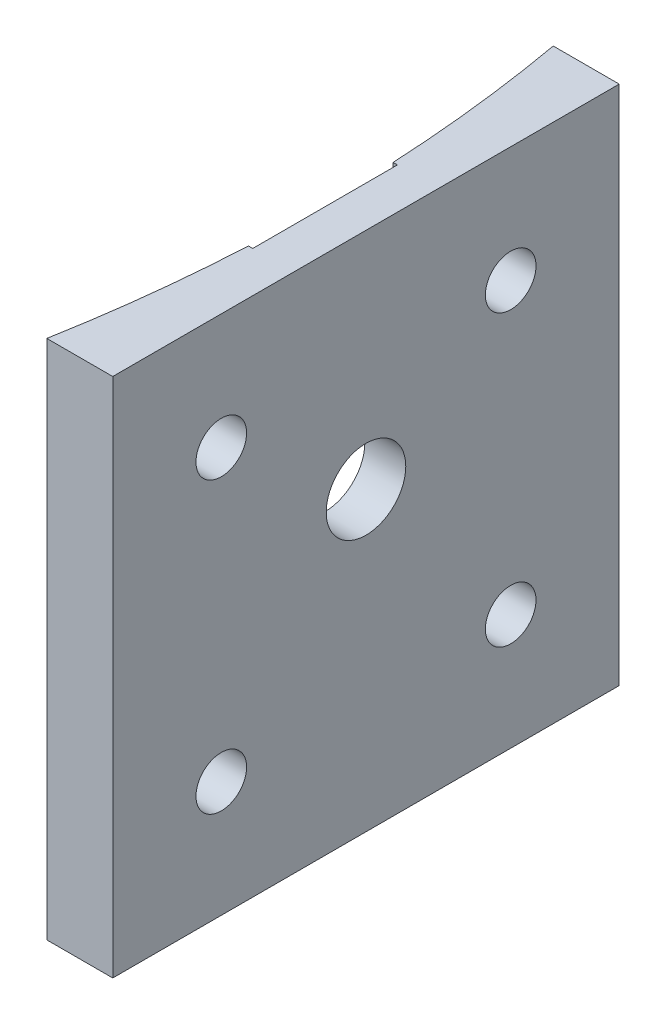
ISO-10303-21;
HEADER;
FILE_DESCRIPTION(('STEP AP214'),'2;1');
FILE_NAME('part.step','',(''),(''),'','','');
FILE_SCHEMA(('AUTOMOTIVE_DESIGN { 1 0 10303 214 1 1 1 1 }'));
ENDSEC;
DATA;
#1=APPLICATION_CONTEXT('core data for automotive mechanical design processes');
#2=APPLICATION_PROTOCOL_DEFINITION('international standard','automotive_design',2000,#1);
#3=PRODUCT_CONTEXT('',#1,'mechanical');
#4=PRODUCT('Part','Part','',(#3));
#5=PRODUCT_RELATED_PRODUCT_CATEGORY('part','',(#4));
#6=PRODUCT_DEFINITION_FORMATION('','',#4);
#7=PRODUCT_DEFINITION_CONTEXT('part definition',#1,'design');
#8=PRODUCT_DEFINITION('design','',#6,#7);
#9=PRODUCT_DEFINITION_SHAPE('','',#8);
#10=(LENGTH_UNIT() NAMED_UNIT(*) SI_UNIT(.MILLI.,.METRE.));
#11=(NAMED_UNIT(*) PLANE_ANGLE_UNIT() SI_UNIT($,.RADIAN.));
#12=(NAMED_UNIT(*) SI_UNIT($,.STERADIAN.) SOLID_ANGLE_UNIT());
#13=UNCERTAINTY_MEASURE_WITH_UNIT(LENGTH_MEASURE(1.E-05),#10,'distance_accuracy_value','');
#14=(GEOMETRIC_REPRESENTATION_CONTEXT(3) GLOBAL_UNCERTAINTY_ASSIGNED_CONTEXT((#13)) GLOBAL_UNIT_ASSIGNED_CONTEXT((#10,
#11,#12)) REPRESENTATION_CONTEXT('',''));
#15=CARTESIAN_POINT('',(0.,0.,0.));
#16=DIRECTION('',(0.,0.,1.));
#17=DIRECTION('',(1.,0.,0.));
#18=AXIS2_PLACEMENT_3D('',#15,#16,#17);
#19=CARTESIAN_POINT('',(-102.,36.,0.));
#20=DIRECTION('',(0.,-1.,0.));
#21=DIRECTION('',(0.,0.,-1.));
#22=AXIS2_PLACEMENT_3D('',#19,#20,#21);
#23=CYLINDRICAL_SURFACE('',#22,99.);
#24=CARTESIAN_POINT('',(-3.6997583929724,28.,-11.75));
#25=CARTESIAN_POINT('',(-3.69975773239781,28.0978039488489,-11.7499955788712));
#26=CARTESIAN_POINT('',(-3.69877385201636,28.1956789308559,-11.7417724058967));
#27=CARTESIAN_POINT('',(-3.69487606208546,28.3887228032019,-11.7090933771447));
#28=CARTESIAN_POINT('',(-3.69195983137928,28.4838882953142,-11.684617998996));
#29=CARTESIAN_POINT('',(-3.68432061460992,28.6686782342036,-11.6201649597345));
#30=CARTESIAN_POINT('',(-3.67959878881144,28.7583061964915,-11.5801972536747));
#31=CARTESIAN_POINT('',(-3.66854264853962,28.9295398076865,-11.4859364462371));
#32=CARTESIAN_POINT('',(-3.66220870634348,29.0111473026935,-11.4316466520754));
#33=CARTESIAN_POINT('',(-3.64815367371014,29.1643747689419,-11.3100870747429));
#34=CARTESIAN_POINT('',(-3.64042780533748,29.2359587801684,-11.2427725218996));
#35=CARTESIAN_POINT('',(-3.62389829897048,29.3668287607726,-11.0972054730592));
#36=CARTESIAN_POINT('',(-3.6150945846844,29.4261138588112,-11.0189522027457));
#37=CARTESIAN_POINT('',(-3.59666955002114,29.5311004443614,-10.8531813276407));
#38=CARTESIAN_POINT('',(-3.58704333144818,29.5767120367381,-10.7656073301989));
#39=CARTESIAN_POINT('',(-3.56735599582918,29.6525792466574,-10.5840881195322));
#40=CARTESIAN_POINT('',(-3.55729486673741,29.6828344385771,-10.4901427297975));
#41=CARTESIAN_POINT('',(-3.5370160332051,29.7272576485935,-10.2980654705491));
#42=CARTESIAN_POINT('',(-3.5267978144062,29.7413492022434,-10.1999159622375));
#43=CARTESIAN_POINT('',(-3.50656200492344,29.752785485012,-10.0026248665384));
#44=CARTESIAN_POINT('',(-3.4965444157462,29.750130088418,-9.90348327170942));
#45=CARTESIAN_POINT('',(-3.47698107162729,29.7281198786233,-9.70693082736418));
#46=CARTESIAN_POINT('',(-3.46743575001202,29.7087500189687,-9.60952161801126));
#47=CARTESIAN_POINT('',(-3.44907035357473,29.6538132914452,-9.41931002198861));
#48=CARTESIAN_POINT('',(-3.44025027199138,29.6182465745983,-9.3265075923735));
#49=CARTESIAN_POINT('',(-3.42355952650221,29.5320102666403,-9.14840818114499));
#50=CARTESIAN_POINT('',(-3.41568649926002,29.4813794136197,-9.06309266662271));
#51=CARTESIAN_POINT('',(-3.40102444365241,29.3663964629136,-8.90216593529734));
#52=CARTESIAN_POINT('',(-3.39423539211206,29.3020446586448,-8.82655451103176));
#53=CARTESIAN_POINT('',(-3.38188906689232,29.161730965499,-8.68752315728345));
#54=CARTESIAN_POINT('',(-3.37632681572983,29.0858181863005,-8.62405410719339));
#55=CARTESIAN_POINT('',(-3.36648570136439,28.9243389836349,-8.51076384759874));
#56=CARTESIAN_POINT('',(-3.36220681109227,28.8387727638345,-8.4609423502363));
#57=CARTESIAN_POINT('',(-3.35500528274996,28.6607703391094,-8.37656328242491));
#58=CARTESIAN_POINT('',(-3.35207750093895,28.5683617699822,-8.3419478463329));
#59=CARTESIAN_POINT('',(-3.34758984767495,28.3790158676386,-8.28870865503887));
#60=CARTESIAN_POINT('',(-3.34602995531453,28.2820786036648,-8.27008465541683));
#61=CARTESIAN_POINT('',(-3.34429778746244,28.0866809276634,-8.24939577639322));
#62=CARTESIAN_POINT('',(-3.34412213222219,27.9882248139451,-8.24729056482981));
#63=CARTESIAN_POINT('',(-3.34515143774367,27.7923576497601,-8.25959392823825));
#64=CARTESIAN_POINT('',(-3.34635638909305,27.6949465921732,-8.27400239062735));
#65=CARTESIAN_POINT('',(-3.35013228511452,27.5039992985341,-8.31890026442874));
#66=CARTESIAN_POINT('',(-3.35270233865219,27.4104605775231,-8.34937918500149));
#67=CARTESIAN_POINT('',(-3.35917734250368,27.2298373251328,-8.42553008658813));
#68=CARTESIAN_POINT('',(-3.3630822958485,27.1427528084088,-8.47120210209913));
#69=CARTESIAN_POINT('',(-3.37218105847478,26.9773919868962,-8.5764861895789));
#70=CARTESIAN_POINT('',(-3.37737640464405,26.8991263483559,-8.63611487935421));
#71=CARTESIAN_POINT('',(-3.38897581829714,26.753718261993,-8.76756819529909));
#72=CARTESIAN_POINT('',(-3.39537990106508,26.686575954842,-8.83939297568356));
#73=CARTESIAN_POINT('',(-3.40930800893146,26.5651044659355,-8.99341077777969));
#74=CARTESIAN_POINT('',(-3.4168352393604,26.5108131453912,-9.0756333677135));
#75=CARTESIAN_POINT('',(-3.43284953762148,26.4167966558975,-9.24793635730128));
#76=CARTESIAN_POINT('',(-3.44133662454492,26.3770717767377,-9.33801691324006));
#77=CARTESIAN_POINT('',(-3.45912140319884,26.3131419353179,-9.52386407482154));
#78=CARTESIAN_POINT('',(-3.46842224956576,26.2890007130387,-9.61965230421147));
#79=CARTESIAN_POINT('',(-3.48757694206297,26.2571461132054,-9.81386887520426));
#80=CARTESIAN_POINT('',(-3.4974308025957,26.2494331637053,-9.91229728553184));
#81=CARTESIAN_POINT('',(-3.51746486132502,26.2506341170585,-10.1094076830143));
#82=CARTESIAN_POINT('',(-3.5276461812943,26.2596129105942,-10.2080891642196));
#83=CARTESIAN_POINT('',(-3.5479970587279,26.2940641938141,-10.4025322400344));
#84=CARTESIAN_POINT('',(-3.55816661598021,26.3195369762626,-10.4982937827842));
#85=CARTESIAN_POINT('',(-3.57818655734018,26.3863250863225,-10.684353789045));
#86=CARTESIAN_POINT('',(-3.58803634502226,26.4276683589754,-10.774642288957));
#87=CARTESIAN_POINT('',(-3.60705888063857,26.5250425879005,-10.9469933945607));
#88=CARTESIAN_POINT('',(-3.61623165797823,26.5810729057703,-11.0290563575781));
#89=CARTESIAN_POINT('',(-3.63354692887308,26.7061234750692,-11.1824355746292));
#90=CARTESIAN_POINT('',(-3.6416915727635,26.7751158378105,-11.25377432006));
#91=CARTESIAN_POINT('',(-3.65666231092752,26.9242551967324,-11.3838583993976));
#92=CARTESIAN_POINT('',(-3.66348811315717,27.004404656793,-11.4426009443207));
#93=CARTESIAN_POINT('',(-3.67551356315785,27.1731275090035,-11.5454772334505));
#94=CARTESIAN_POINT('',(-3.68072126396407,27.2616562271525,-11.5896833892965));
#95=CARTESIAN_POINT('',(-3.68933722063227,27.44489331161,-11.6625444545664));
#96=CARTESIAN_POINT('',(-3.69274772603317,27.5395937850399,-11.6912188063192));
#97=CARTESIAN_POINT('',(-3.69670557131032,27.6957663788834,-11.7244383985689));
#98=CARTESIAN_POINT('',(-3.69784836912808,27.7562002008317,-11.7340115392699));
#99=CARTESIAN_POINT('',(-3.69937498488005,27.8777467639867,-11.7467937088638));
#100=CARTESIAN_POINT('',(-3.69975880591953,27.9388595024146,-11.7500027637945));
#101=CARTESIAN_POINT('',(-3.6997583929724,28.,-11.75));
#102=B_SPLINE_CURVE_WITH_KNOTS('',3,(#24,#25,#26,#27,#28,#29,#30,#31,#32,#33,#34,#35,#36,#37,
#38,#39,#40,#41,#42,#43,#44,#45,#46,#47,#48,#49,#50,#51,#52,#53,#54,#55,#56,#57,#58,#59,#60,#61,
#62,#63,#64,#65,#66,#67,#68,#69,#70,#71,#72,#73,#74,#75,#76,#77,#78,#79,#80,#81,#82,#83,#84,#85,
#86,#87,#88,#89,#90,#91,#92,#93,#94,#95,#96,#97,#98,#99,#100,#101),.UNSPECIFIED.,.T.,.F.,(4,2,2,
2,2,2,2,2,2,2,2,2,2,2,2,2,2,2,2,2,2,2,2,2,2,2,2,2,2,2,2,2,2,2,2,2,2,2,4),(0.,0.293187804268997,
0.586728428378113,0.880080741144629,1.17336537303324,1.46767661195626,1.76200869478049,
2.05823541286853,2.35447034082239,2.65210094553959,2.94973378445385,3.24763483397235,
3.54553310587342,3.84267184460008,4.13980422977777,4.43570793150258,4.73160539146626,
5.02636686741931,5.32112383803069,5.61516090737778,5.90919597212512,6.20303932718503,
6.49688334944354,6.79107903922151,7.08527844926838,7.38033412327548,7.67539566689779,
7.97165654435701,8.26792514107702,8.56534791843978,8.86277597513033,9.16073016869785,
9.45867141322246,9.75597881034411,10.0533519678739,10.3492205206003,10.6447178514117,
10.8280000377739,11.0112814742595),.UNSPECIFIED.);
#103=CARTESIAN_POINT('',(-3.6997583929724,28.,-11.75));
#104=VERTEX_POINT('',#103);
#105=EDGE_CURVE('E173',#104,#104,#102,.T.);
#106=ORIENTED_EDGE('',*,*,#105,.T.);
#107=EDGE_LOOP('',(#106));
#108=FACE_BOUND('',#107,.T.);
#109=CARTESIAN_POINT('',(-3.69975839297242,8.,-11.75));
#110=CARTESIAN_POINT('',(-3.69975773239783,8.09780394884888,-11.7499955788712));
#111=CARTESIAN_POINT('',(-3.69877385201636,8.19567893085588,-11.7417724058967));
#112=CARTESIAN_POINT('',(-3.69487606208545,8.38872280320192,-11.7090933771447));
#113=CARTESIAN_POINT('',(-3.69195983137927,8.48388829531422,-11.684617998996));
#114=CARTESIAN_POINT('',(-3.68432061460993,8.66867823420361,-11.6201649597346));
#115=CARTESIAN_POINT('',(-3.67959878881145,8.75830619649147,-11.5801972536747));
#116=CARTESIAN_POINT('',(-3.66854264853962,8.92953980768648,-11.4859364462371));
#117=CARTESIAN_POINT('',(-3.66220870634348,9.0111473026935,-11.4316466520754));
#118=CARTESIAN_POINT('',(-3.64815367371014,9.1643747689419,-11.3100870747429));
#119=CARTESIAN_POINT('',(-3.64042780533747,9.23595878016844,-11.2427725218996));
#120=CARTESIAN_POINT('',(-3.62389829897048,9.36682876077258,-11.0972054730592));
#121=CARTESIAN_POINT('',(-3.61509458468441,9.42611385881124,-11.0189522027457));
#122=CARTESIAN_POINT('',(-3.59666955002116,9.5311004443614,-10.8531813276407));
#123=CARTESIAN_POINT('',(-3.58704333144819,9.5767120367381,-10.7656073301989));
#124=CARTESIAN_POINT('',(-3.56735599582918,9.6525792466574,-10.5840881195322));
#125=CARTESIAN_POINT('',(-3.55729486673741,9.68283443857711,-10.4901427297975));
#126=CARTESIAN_POINT('',(-3.5370160332051,9.72725764859345,-10.2980654705491));
#127=CARTESIAN_POINT('',(-3.5267978144062,9.74134920224345,-10.1999159622375));
#128=CARTESIAN_POINT('',(-3.50656200492344,9.75278548501204,-10.0026248665384));
#129=CARTESIAN_POINT('',(-3.4965444157462,9.75013008841796,-9.90348327170942));
#130=CARTESIAN_POINT('',(-3.47698107162729,9.72811987862327,-9.70693082736418));
#131=CARTESIAN_POINT('',(-3.46743575001202,9.70875001896868,-9.60952161801127));
#132=CARTESIAN_POINT('',(-3.44907035357474,9.65381329144524,-9.41931002198862));
#133=CARTESIAN_POINT('',(-3.44025027199138,9.61824657459833,-9.32650759237352));
#134=CARTESIAN_POINT('',(-3.42355952650221,9.53201026664027,-9.148408181145));
#135=CARTESIAN_POINT('',(-3.41568649926003,9.48137941361974,-9.06309266662272));
#136=CARTESIAN_POINT('',(-3.40102444365241,9.36639646291364,-8.90216593529734));
#137=CARTESIAN_POINT('',(-3.39423539211204,9.3020446586448,-8.82655451103177));
#138=CARTESIAN_POINT('',(-3.38188906689231,9.16173096549896,-8.68752315728346));
#139=CARTESIAN_POINT('',(-3.37632681572984,9.08581818630054,-8.6240541071934));
#140=CARTESIAN_POINT('',(-3.36648570136441,8.92433898363493,-8.51076384759875));
#141=CARTESIAN_POINT('',(-3.36220681109228,8.83877276383445,-8.46094235023631));
#142=CARTESIAN_POINT('',(-3.35500528274995,8.66077033910939,-8.37656328242492));
#143=CARTESIAN_POINT('',(-3.35207750093894,8.56836176998215,-8.34194784633291));
#144=CARTESIAN_POINT('',(-3.34758984767495,8.37901586763864,-8.28870865503887));
#145=CARTESIAN_POINT('',(-3.34602995531454,8.28207860366477,-8.27008465541684));
#146=CARTESIAN_POINT('',(-3.34429778746245,8.08668092766337,-8.24939577639323));
#147=CARTESIAN_POINT('',(-3.3441221322222,7.98822481394508,-8.24729056482981));
#148=CARTESIAN_POINT('',(-3.34515143774367,7.79235764976007,-8.25959392823825));
#149=CARTESIAN_POINT('',(-3.34635638909305,7.6949465921732,-8.27400239062736));
#150=CARTESIAN_POINT('',(-3.35013228511452,7.50399929853414,-8.31890026442874));
#151=CARTESIAN_POINT('',(-3.3527023386522,7.41046057752312,-8.34937918500149));
#152=CARTESIAN_POINT('',(-3.35917734250369,7.22983732513277,-8.42553008658814));
#153=CARTESIAN_POINT('',(-3.3630822958485,7.14275280840877,-8.47120210209913));
#154=CARTESIAN_POINT('',(-3.37218105847477,6.9773919868962,-8.57648618957891));
#155=CARTESIAN_POINT('',(-3.37737640464404,6.89912634835586,-8.63611487935421));
#156=CARTESIAN_POINT('',(-3.38897581829714,6.753718261993,-8.76756819529909));
#157=CARTESIAN_POINT('',(-3.39537990106509,6.68657595484198,-8.83939297568357));
#158=CARTESIAN_POINT('',(-3.40930800893147,6.56510446593555,-8.99341077777969));
#159=CARTESIAN_POINT('',(-3.41683523936041,6.51081314539117,-9.07563336771351));
#160=CARTESIAN_POINT('',(-3.43284953762148,6.41679665589746,-9.24793635730129));
#161=CARTESIAN_POINT('',(-3.44133662454492,6.37707177673765,-9.33801691324006));
#162=CARTESIAN_POINT('',(-3.45912140319884,6.31314193531787,-9.52386407482154));
#163=CARTESIAN_POINT('',(-3.46842224956576,6.28900071303869,-9.61965230421147));
#164=CARTESIAN_POINT('',(-3.48757694206297,6.25714611320536,-9.81386887520426));
#165=CARTESIAN_POINT('',(-3.4974308025957,6.24943316370528,-9.91229728553185));
#166=CARTESIAN_POINT('',(-3.51746486132502,6.25063411705853,-10.1094076830143));
#167=CARTESIAN_POINT('',(-3.5276461812943,6.25961291059422,-10.2080891642196));
#168=CARTESIAN_POINT('',(-3.5479970587279,6.29406419381408,-10.4025322400344));
#169=CARTESIAN_POINT('',(-3.55816661598021,6.3195369762626,-10.4982937827842));
#170=CARTESIAN_POINT('',(-3.57818655734018,6.38632508632248,-10.684353789045));
#171=CARTESIAN_POINT('',(-3.58803634502226,6.42766835897537,-10.774642288957));
#172=CARTESIAN_POINT('',(-3.60705888063857,6.52504258790052,-10.9469933945607));
#173=CARTESIAN_POINT('',(-3.61623165797823,6.58107290577025,-11.0290563575781));
#174=CARTESIAN_POINT('',(-3.63354692887308,6.70612347506924,-11.1824355746292));
#175=CARTESIAN_POINT('',(-3.6416915727635,6.77511583781046,-11.25377432006));
#176=CARTESIAN_POINT('',(-3.65666231092752,6.92425519673235,-11.3838583993976));
#177=CARTESIAN_POINT('',(-3.66348811315717,7.00440465679296,-11.4426009443207));
#178=CARTESIAN_POINT('',(-3.67551356315785,7.17312750900344,-11.5454772334505));
#179=CARTESIAN_POINT('',(-3.68072126396406,7.26165622715254,-11.5896833892965));
#180=CARTESIAN_POINT('',(-3.68933722063227,7.44489331161002,-11.6625444545664));
#181=CARTESIAN_POINT('',(-3.69274772603317,7.53959378503988,-11.6912188063192));
#182=CARTESIAN_POINT('',(-3.69670557131032,7.69576637888338,-11.7244383985689));
#183=CARTESIAN_POINT('',(-3.69784836912807,7.7562002008317,-11.7340115392699));
#184=CARTESIAN_POINT('',(-3.69937498488005,7.87774676398666,-11.7467937088638));
#185=CARTESIAN_POINT('',(-3.69975880591954,7.93885950241456,-11.7500027637945));
#186=CARTESIAN_POINT('',(-3.69975839297242,8.,-11.75));
#187=B_SPLINE_CURVE_WITH_KNOTS('',3,(#109,#110,#111,#112,#113,#114,#115,#116,#117,#118,#119,
#120,#121,#122,#123,#124,#125,#126,#127,#128,#129,#130,#131,#132,#133,#134,#135,#136,#137,#138,
#139,#140,#141,#142,#143,#144,#145,#146,#147,#148,#149,#150,#151,#152,#153,#154,#155,#156,#157,
#158,#159,#160,#161,#162,#163,#164,#165,#166,#167,#168,#169,#170,#171,#172,#173,#174,#175,#176,
#177,#178,#179,#180,#181,#182,#183,#184,#185,#186),.UNSPECIFIED.,.T.,.F.,(4,2,2,2,2,2,2,2,2,2,2,
2,2,2,2,2,2,2,2,2,2,2,2,2,2,2,2,2,2,2,2,2,2,2,2,2,2,2,4),(0.,0.293187804268995,
0.586728428378111,0.880080741144623,1.17336537303323,1.46767661195626,1.76200869478049,
2.05823541286852,2.35447034082238,2.65210094553959,2.94973378445385,3.24763483397235,
3.54553310587341,3.84267184460008,4.13980422977777,4.43570793150257,4.73160539146626,
5.02636686741931,5.32112383803069,5.61516090737778,5.90919597212511,6.20303932718502,
6.49688334944353,6.7910790392215,7.08527844926838,7.38033412327547,7.67539566689778,
7.97165654435701,8.26792514107702,8.56534791843978,8.86277597513033,9.16073016869785,
9.45867141322245,9.7559788103441,10.0533519678739,10.3492205206003,10.6447178514117,
10.8280000377739,11.0112814742595),.UNSPECIFIED.);
#188=CARTESIAN_POINT('',(-3.69975839297242,8.,-11.75));
#189=VERTEX_POINT('',#188);
#190=EDGE_CURVE('E220',#189,#189,#187,.T.);
#191=ORIENTED_EDGE('',*,*,#190,.T.);
#192=EDGE_LOOP('',(#191));
#193=FACE_BOUND('',#192,.T.);
#194=CARTESIAN_POINT('',(-102.,0.,0.));
#195=DIRECTION('',(0.,-1.,0.));
#196=DIRECTION('',(0.,0.,-1.));
#197=AXIS2_PLACEMENT_3D('',#194,#195,#196);
#198=CIRCLE('',#197,99.);
#199=CARTESIAN_POINT('',(-4.55899220554007,0.,-17.5));
#200=VERTEX_POINT('',#199);
#201=CARTESIAN_POINT('',(-3.12634324553381,0.,-5.));
#202=VERTEX_POINT('',#201);
#203=EDGE_CURVE('E223',#200,#202,#198,.T.);
#204=ORIENTED_EDGE('',*,*,#203,.T.);
#205=DIRECTION('',(0.,1.,0.));
#206=VECTOR('',#205,1.);
#207=CARTESIAN_POINT('',(-3.12634324553381,0.,-5.));
#208=LINE('',#207,#206);
#209=CARTESIAN_POINT('',(-3.12634324553381,36.,-5.));
#210=VERTEX_POINT('',#209);
#211=EDGE_CURVE('E150',#202,#210,#208,.T.);
#212=ORIENTED_EDGE('',*,*,#211,.T.);
#213=CARTESIAN_POINT('',(-102.,36.,0.));
#214=DIRECTION('',(0.,-1.,0.));
#215=DIRECTION('',(0.,0.,-1.));
#216=AXIS2_PLACEMENT_3D('',#213,#214,#215);
#217=CIRCLE('',#216,99.);
#218=CARTESIAN_POINT('',(-4.55899220554007,36.,-17.5));
#219=VERTEX_POINT('',#218);
#220=EDGE_CURVE('E247',#219,#210,#217,.T.);
#221=ORIENTED_EDGE('',*,*,#220,.F.);
#222=DIRECTION('',(0.,-1.,0.));
#223=VECTOR('',#222,1.);
#224=CARTESIAN_POINT('',(-4.55899220554007,36.,-17.5));
#225=LINE('',#224,#223);
#226=EDGE_CURVE('E225',#219,#200,#225,.T.);
#227=ORIENTED_EDGE('',*,*,#226,.T.);
#228=EDGE_LOOP('',(#204,#212,#221,#227));
#229=FACE_BOUND('',#228,.T.);
#230=ADVANCED_FACE('F38',(#108,#193,#229),#23,.F.);
#231=CARTESIAN_POINT('',(-3.34434886941347,8.,8.25));
#232=CARTESIAN_POINT('',(-3.34434910380967,8.09802941640019,8.25000438037108));
#233=CARTESIAN_POINT('',(-3.34503894606679,8.1961298354043,8.25826503561314));
#234=CARTESIAN_POINT('',(-3.34779300366129,8.38962487015928,8.29109857904202));
#235=CARTESIAN_POINT('',(-3.34985886911259,8.48501609369704,8.31569105208396));
#236=CARTESIAN_POINT('',(-3.35534099825587,8.67025766840264,8.38047140014755));
#237=CARTESIAN_POINT('',(-3.35875653545897,8.7601109704433,8.42065088492372));
#238=CARTESIAN_POINT('',(-3.3668938164125,8.93175903354599,8.51543399071043));
#239=CARTESIAN_POINT('',(-3.37161524140522,9.01355575456182,8.57003409160694));
#240=CARTESIAN_POINT('',(-3.38230504641459,9.16693244380725,8.6921800813038));
#241=CARTESIAN_POINT('',(-3.38827520799407,9.23849756641732,8.75974445462711));
#242=CARTESIAN_POINT('',(-3.40136155812474,9.36927393827191,8.90583318011497));
#243=CARTESIAN_POINT('',(-3.40847780769498,9.42848452936132,8.98435811580287));
#244=CARTESIAN_POINT('',(-3.42375026108904,9.53308592189318,9.15040716212424));
#245=CARTESIAN_POINT('',(-3.43190986520561,9.57842981544155,9.23796050722234));
#246=CARTESIAN_POINT('',(-3.4490790277854,9.6537832199736,9.41935602534368));
#247=CARTESIAN_POINT('',(-3.45808860417954,9.68379240737244,9.51319833102598));
#248=CARTESIAN_POINT('',(-3.47678575225718,9.72775689893703,9.70492476155469));
#249=CARTESIAN_POINT('',(-3.4864760109703,9.74164429133118,9.80282419790318));
#250=CARTESIAN_POINT('',(-3.50624762224954,9.75277045335256,9.99952562587086));
#251=CARTESIAN_POINT('',(-3.51632898309537,9.75000887032702,10.0983276365638));
#252=CARTESIAN_POINT('',(-3.53662989521459,9.72788874144924,10.2943914940294));
#253=CARTESIAN_POINT('',(-3.54684980316041,9.70847299095969,10.391646854196));
#254=CARTESIAN_POINT('',(-3.56707517976838,9.65351429357388,10.5815137176725));
#255=CARTESIAN_POINT('',(-3.57708064590316,9.61797115671282,10.6741251662674));
#256=CARTESIAN_POINT('',(-3.59654885784865,9.53171610880674,10.8521350126281));
#257=CARTESIAN_POINT('',(-3.60601122983696,9.48099389546069,10.9375284607689));
#258=CARTESIAN_POINT('',(-3.62404760698188,9.36580181873777,11.0985840512581));
#259=CARTESIAN_POINT('',(-3.63262162370575,9.3013321344,11.174246320319));
#260=CARTESIAN_POINT('',(-3.64853088539114,9.16068469357539,11.3134178941833));
#261=CARTESIAN_POINT('',(-3.65587009822472,9.08454600180038,11.3769662165742));
#262=CARTESIAN_POINT('',(-3.66905408975411,8.92255318173354,11.4903588203761));
#263=CARTESIAN_POINT('',(-3.67489891925634,8.83669938388143,11.540203567689));
#264=CARTESIAN_POINT('',(-3.68482346667592,8.65827955620992,11.6244509692754));
#265=CARTESIAN_POINT('',(-3.68891386336808,8.5657582576215,11.658947096059));
#266=CARTESIAN_POINT('',(-3.69521066095367,8.37617760823423,11.7119217570236));
#267=CARTESIAN_POINT('',(-3.69741713114372,8.27911842449129,11.7304008803596));
#268=CARTESIAN_POINT('',(-3.69984523339342,8.08381568832976,11.7507309965948));
#269=CARTESIAN_POINT('',(-3.70007820843479,7.98558215870647,11.7526770163649));
#270=CARTESIAN_POINT('',(-3.69857925514602,7.79018668264279,11.7401327963076));
#271=CARTESIAN_POINT('',(-3.69684735907676,7.69302471863498,11.7256428263399));
#272=CARTESIAN_POINT('',(-3.69149674592585,7.50270804417549,11.6806974738747));
#273=CARTESIAN_POINT('',(-3.68788143220671,7.40954643262568,11.6502708885334));
#274=CARTESIAN_POINT('',(-3.67891575716386,7.22966498674326,11.5743615616592));
#275=CARTESIAN_POINT('',(-3.67356537383642,7.14294523412192,11.528878629185));
#276=CARTESIAN_POINT('',(-3.6613251104663,6.97809229782287,11.4240013456528));
#277=CARTESIAN_POINT('',(-3.65443024682657,6.89998815999727,11.3645619303906));
#278=CARTESIAN_POINT('',(-3.63938049996547,6.75485447994872,11.2335598828896));
#279=CARTESIAN_POINT('',(-3.63122557516031,6.68782530336621,11.1619968505468));
#280=CARTESIAN_POINT('',(-3.61390585019806,6.56629629652206,11.0082916515098));
#281=CARTESIAN_POINT('',(-3.60473504143444,6.51187762033379,10.9260859959888));
#282=CARTESIAN_POINT('',(-3.58575401969795,6.41760701305044,10.7537757195781));
#283=CARTESIAN_POINT('',(-3.57594378644931,6.37775554413773,10.6636708481776));
#284=CARTESIAN_POINT('',(-3.55595848679019,6.3135335530887,10.4775707811275));
#285=CARTESIAN_POINT('',(-3.54578168978714,6.28925067286004,10.381545517675));
#286=CARTESIAN_POINT('',(-3.5254388512349,6.25719876851798,10.1867752887851));
#287=CARTESIAN_POINT('',(-3.51527280988336,6.24943004277089,10.0880302742418));
#288=CARTESIAN_POINT('',(-3.49522884428971,6.25063643713771,9.89039662836534));
#289=CARTESIAN_POINT('',(-3.48535158741481,6.25964763908794,9.79150814548701));
#290=CARTESIAN_POINT('',(-3.46617570640457,6.29425175308504,9.59661719354341));
#291=CARTESIAN_POINT('',(-3.45687708047948,6.31984461384078,9.50061471555196));
#292=CARTESIAN_POINT('',(-3.43910138718364,6.38685845512186,9.31439779516043));
#293=CARTESIAN_POINT('',(-3.43062301446469,6.42825375051625,9.22417423621176));
#294=CARTESIAN_POINT('',(-3.41465758765549,6.52572538413945,9.05194732028006));
#295=CARTESIAN_POINT('',(-3.40717047613328,6.58180087126252,8.96994348712735));
#296=CARTESIAN_POINT('',(-3.39336077321687,6.706805556743,8.81683599819996));
#297=CARTESIAN_POINT('',(-3.38703367348449,6.77568280359274,8.74569033152575));
#298=CARTESIAN_POINT('',(-3.37561382385624,6.92451457247265,8.61595641492978));
#299=CARTESIAN_POINT('',(-3.37052135450583,7.00447160569165,8.5573710194317));
#300=CARTESIAN_POINT('',(-3.36166517449068,7.1728541529253,8.45467672145803));
#301=CARTESIAN_POINT('',(-3.35789672937336,7.26124802571436,8.41051627883142));
#302=CARTESIAN_POINT('',(-3.35171572459523,7.44416787090154,8.33770696984144));
#303=CARTESIAN_POINT('',(-3.3493015104306,7.53868620260706,8.30903917722569));
#304=CARTESIAN_POINT('',(-3.34650207049025,7.69484604615533,8.275717403551));
#305=CARTESIAN_POINT('',(-3.34569512680103,7.75546311983021,8.26608566975607));
#306=CARTESIAN_POINT('',(-3.34461845339424,7.87737753416439,8.25322560318989));
#307=CARTESIAN_POINT('',(-3.34434872278017,7.93867487368829,8.24999725973265));
#308=CARTESIAN_POINT('',(-3.34434886941347,8.,8.25));
#309=B_SPLINE_CURVE_WITH_KNOTS('',3,(#231,#232,#233,#234,#235,#236,#237,#238,#239,#240,#241,
#242,#243,#244,#245,#246,#247,#248,#249,#250,#251,#252,#253,#254,#255,#256,#257,#258,#259,#260,
#261,#262,#263,#264,#265,#266,#267,#268,#269,#270,#271,#272,#273,#274,#275,#276,#277,#278,#279,
#280,#281,#282,#283,#284,#285,#286,#287,#288,#289,#290,#291,#292,#293,#294,#295,#296,#297,#298,
#299,#300,#301,#302,#303,#304,#305,#306,#307,#308),.UNSPECIFIED.,.T.,.F.,(4,2,2,2,2,2,2,2,2,2,2,
2,2,2,2,2,2,2,2,2,2,2,2,2,2,2,2,2,2,2,2,2,2,2,2,2,2,2,4),(0.,0.293864087180475,
0.588081209356523,0.882140178303486,1.17612743284288,1.4705370131237,1.76496227329678,
2.06037276267342,2.35578948538826,2.65244616299329,2.94910912429842,3.24679517886509,
3.54448473997243,3.84237680813711,4.140264996965,4.43717688250768,4.73407867222577,
5.02914672899514,5.32420393178504,5.61756408676876,5.91091942519306,6.20374649569512,
6.49657727990545,6.79036691588852,7.08416624941538,7.37980682489719,7.6754567795275,
7.97275678380011,8.27006215943774,8.56800756842489,8.86595205579803,9.16341431482146,
9.46085933185015,9.75712263166189,10.0534531885139,10.3487130747669,10.643611443248,
10.8274468979576,11.0112820458814),.UNSPECIFIED.);
#310=CARTESIAN_POINT('',(-3.34434886941347,8.,8.25));
#311=VERTEX_POINT('',#310);
#312=EDGE_CURVE('E230',#311,#311,#309,.T.);
#313=ORIENTED_EDGE('',*,*,#312,.T.);
#314=EDGE_LOOP('',(#313));
#315=FACE_BOUND('',#314,.T.);
#316=CARTESIAN_POINT('',(-3.34434886941347,28.,8.25));
#317=CARTESIAN_POINT('',(-3.34434910380967,28.0980294164002,8.25000438037108));
#318=CARTESIAN_POINT('',(-3.34503894606679,28.1961298354043,8.25826503561314));
#319=CARTESIAN_POINT('',(-3.34779300366129,28.3896248701593,8.29109857904202));
#320=CARTESIAN_POINT('',(-3.34985886911259,28.485016093697,8.31569105208396));
#321=CARTESIAN_POINT('',(-3.35534099825587,28.6702576684026,8.38047140014755));
#322=CARTESIAN_POINT('',(-3.35875653545897,28.7601109704433,8.42065088492372));
#323=CARTESIAN_POINT('',(-3.3668938164125,28.931759033546,8.51543399071043));
#324=CARTESIAN_POINT('',(-3.37161524140522,29.0135557545618,8.57003409160694));
#325=CARTESIAN_POINT('',(-3.38230504641459,29.1669324438073,8.6921800813038));
#326=CARTESIAN_POINT('',(-3.38827520799407,29.2384975664173,8.75974445462712));
#327=CARTESIAN_POINT('',(-3.40136155812474,29.3692739382719,8.90583318011498));
#328=CARTESIAN_POINT('',(-3.40847780769498,29.4284845293613,8.98435811580287));
#329=CARTESIAN_POINT('',(-3.42375026108904,29.5330859218932,9.15040716212424));
#330=CARTESIAN_POINT('',(-3.43190986520561,29.5784298154416,9.23796050722235));
#331=CARTESIAN_POINT('',(-3.4490790277854,29.6537832199736,9.41935602534369));
#332=CARTESIAN_POINT('',(-3.45808860417954,29.6837924073724,9.51319833102598));
#333=CARTESIAN_POINT('',(-3.47678575225718,29.727756898937,9.70492476155469));
#334=CARTESIAN_POINT('',(-3.4864760109703,29.7416442913312,9.80282419790318));
#335=CARTESIAN_POINT('',(-3.50624762224955,29.7527704533526,9.99952562587086));
#336=CARTESIAN_POINT('',(-3.51632898309537,29.750008870327,10.0983276365638));
#337=CARTESIAN_POINT('',(-3.53662989521459,29.7278887414492,10.2943914940294));
#338=CARTESIAN_POINT('',(-3.54684980316041,29.7084729909597,10.391646854196));
#339=CARTESIAN_POINT('',(-3.56707517976838,29.6535142935739,10.5815137176725));
#340=CARTESIAN_POINT('',(-3.57708064590316,29.6179711567128,10.6741251662674));
#341=CARTESIAN_POINT('',(-3.59654885784866,29.5317161088067,10.8521350126281));
#342=CARTESIAN_POINT('',(-3.60601122983696,29.4809938954607,10.9375284607689));
#343=CARTESIAN_POINT('',(-3.62404760698188,29.3658018187378,11.0985840512581));
#344=CARTESIAN_POINT('',(-3.63262162370575,29.3013321344,11.174246320319));
#345=CARTESIAN_POINT('',(-3.64853088539115,29.1606846935754,11.3134178941833));
#346=CARTESIAN_POINT('',(-3.65587009822472,29.0845460018004,11.3769662165742));
#347=CARTESIAN_POINT('',(-3.66905408975411,28.9225531817335,11.4903588203761));
#348=CARTESIAN_POINT('',(-3.67489891925634,28.8366993838814,11.540203567689));
#349=CARTESIAN_POINT('',(-3.68482346667591,28.6582795562099,11.6244509692754));
#350=CARTESIAN_POINT('',(-3.68891386336807,28.5657582576215,11.658947096059));
#351=CARTESIAN_POINT('',(-3.69521066095366,28.3761776082342,11.7119217570236));
#352=CARTESIAN_POINT('',(-3.69741713114371,28.2791184244913,11.7304008803596));
#353=CARTESIAN_POINT('',(-3.69984523339343,28.0838156883298,11.7507309965948));
#354=CARTESIAN_POINT('',(-3.70007820843479,27.9855821587065,11.7526770163649));
#355=CARTESIAN_POINT('',(-3.69857925514602,27.7901866826428,11.7401327963076));
#356=CARTESIAN_POINT('',(-3.69684735907676,27.693024718635,11.7256428263399));
#357=CARTESIAN_POINT('',(-3.69149674592586,27.5027080441755,11.6806974738747));
#358=CARTESIAN_POINT('',(-3.68788143220671,27.4095464326257,11.6502708885334));
#359=CARTESIAN_POINT('',(-3.67891575716386,27.2296649867433,11.5743615616592));
#360=CARTESIAN_POINT('',(-3.67356537383642,27.1429452341219,11.528878629185));
#361=CARTESIAN_POINT('',(-3.6613251104663,26.9780922978229,11.4240013456528));
#362=CARTESIAN_POINT('',(-3.65443024682657,26.8999881599973,11.3645619303906));
#363=CARTESIAN_POINT('',(-3.63938049996547,26.7548544799487,11.2335598828896));
#364=CARTESIAN_POINT('',(-3.63122557516031,26.6878253033662,11.1619968505468));
#365=CARTESIAN_POINT('',(-3.61390585019805,26.5662962965221,11.0082916515098));
#366=CARTESIAN_POINT('',(-3.60473504143443,26.5118776203338,10.9260859959888));
#367=CARTESIAN_POINT('',(-3.58575401969794,26.4176070130504,10.7537757195781));
#368=CARTESIAN_POINT('',(-3.57594378644931,26.3777555441377,10.6636708481776));
#369=CARTESIAN_POINT('',(-3.55595848679019,26.3135335530887,10.4775707811275));
#370=CARTESIAN_POINT('',(-3.54578168978713,26.28925067286,10.3815455176749));
#371=CARTESIAN_POINT('',(-3.52543885123489,26.257198768518,10.1867752887851));
#372=CARTESIAN_POINT('',(-3.51527280988336,26.2494300427709,10.0880302742418));
#373=CARTESIAN_POINT('',(-3.49522884428972,26.2506364371377,9.89039662836534));
#374=CARTESIAN_POINT('',(-3.48535158741481,26.2596476390879,9.79150814548701));
#375=CARTESIAN_POINT('',(-3.46617570640456,26.294251753085,9.59661719354341));
#376=CARTESIAN_POINT('',(-3.45687708047948,26.3198446138408,9.50061471555196));
#377=CARTESIAN_POINT('',(-3.43910138718364,26.3868584551219,9.31439779516043));
#378=CARTESIAN_POINT('',(-3.43062301446469,26.4282537505163,9.22417423621176));
#379=CARTESIAN_POINT('',(-3.41465758765549,26.5257253841395,9.05194732028006));
#380=CARTESIAN_POINT('',(-3.40717047613328,26.5818008712625,8.96994348712735));
#381=CARTESIAN_POINT('',(-3.39336077321687,26.706805556743,8.81683599819996));
#382=CARTESIAN_POINT('',(-3.38703367348449,26.7756828035927,8.74569033152575));
#383=CARTESIAN_POINT('',(-3.37561382385624,26.9245145724726,8.61595641492978));
#384=CARTESIAN_POINT('',(-3.37052135450583,27.0044716056917,8.5573710194317));
#385=CARTESIAN_POINT('',(-3.36166517449069,27.1728541529253,8.45467672145803));
#386=CARTESIAN_POINT('',(-3.35789672937336,27.2612480257144,8.41051627883142));
#387=CARTESIAN_POINT('',(-3.35171572459523,27.4441678709015,8.33770696984143));
#388=CARTESIAN_POINT('',(-3.3493015104306,27.5386862026071,8.30903917722569));
#389=CARTESIAN_POINT('',(-3.34650207049025,27.6948460461553,8.275717403551));
#390=CARTESIAN_POINT('',(-3.34569512680103,27.7554631198302,8.26608566975606));
#391=CARTESIAN_POINT('',(-3.34461845339424,27.8773775341644,8.25322560318989));
#392=CARTESIAN_POINT('',(-3.34434872278017,27.9386748736883,8.24999725973265));
#393=CARTESIAN_POINT('',(-3.34434886941347,28.,8.25));
#394=B_SPLINE_CURVE_WITH_KNOTS('',3,(#316,#317,#318,#319,#320,#321,#322,#323,#324,#325,#326,
#327,#328,#329,#330,#331,#332,#333,#334,#335,#336,#337,#338,#339,#340,#341,#342,#343,#344,#345,
#346,#347,#348,#349,#350,#351,#352,#353,#354,#355,#356,#357,#358,#359,#360,#361,#362,#363,#364,
#365,#366,#367,#368,#369,#370,#371,#372,#373,#374,#375,#376,#377,#378,#379,#380,#381,#382,#383,
#384,#385,#386,#387,#388,#389,#390,#391,#392,#393),.UNSPECIFIED.,.T.,.F.,(4,2,2,2,2,2,2,2,2,2,2,
2,2,2,2,2,2,2,2,2,2,2,2,2,2,2,2,2,2,2,2,2,2,2,2,2,2,2,4),(0.,0.293864087180475,
0.588081209356525,0.88214017830349,1.17612743284288,1.47053701312371,1.76496227329678,
2.06037276267343,2.35578948538827,2.6524461629933,2.94910912429842,3.24679517886509,
3.54448473997244,3.84237680813711,4.14026499696501,4.43717688250769,4.73407867222578,
5.02914672899515,5.32420393178504,5.61756408676877,5.91091942519307,6.20374649569513,
6.49657727990545,6.79036691588852,7.08416624941538,7.37980682489719,7.6754567795275,
7.97275678380012,8.27006215943774,8.5680075684249,8.86595205579803,9.16341431482147,
9.46085933185016,9.7571226316619,10.0534531885139,10.3487130747669,10.643611443248,
10.8274468979576,11.0112820458814),.UNSPECIFIED.);
#395=CARTESIAN_POINT('',(-3.34434886941347,28.,8.25));
#396=VERTEX_POINT('',#395);
#397=EDGE_CURVE('E166',#396,#396,#394,.T.);
#398=ORIENTED_EDGE('',*,*,#397,.T.);
#399=EDGE_LOOP('',(#398));
#400=FACE_BOUND('',#399,.T.);
#401=CARTESIAN_POINT('',(-3.12634324553381,36.,5.));
#402=VERTEX_POINT('',#401);
#403=CARTESIAN_POINT('',(-4.55899220554007,36.,17.5));
#404=VERTEX_POINT('',#403);
#405=EDGE_CURVE('E88',#402,#404,#217,.T.);
#406=ORIENTED_EDGE('',*,*,#405,.F.);
#407=DIRECTION('',(0.,1.,0.));
#408=VECTOR('',#407,1.);
#409=CARTESIAN_POINT('',(-3.12634324553381,0.,5.));
#410=LINE('',#409,#408);
#411=CARTESIAN_POINT('',(-3.12634324553381,0.,5.));
#412=VERTEX_POINT('',#411);
#413=EDGE_CURVE('E120',#412,#402,#410,.T.);
#414=ORIENTED_EDGE('',*,*,#413,.F.);
#415=CARTESIAN_POINT('',(-4.55899220554007,0.,17.5));
#416=VERTEX_POINT('',#415);
#417=EDGE_CURVE('E227',#412,#416,#198,.T.);
#418=ORIENTED_EDGE('',*,*,#417,.T.);
#419=DIRECTION('',(0.,-1.,0.));
#420=VECTOR('',#419,1.);
#421=CARTESIAN_POINT('',(-4.55899220554007,36.,17.5));
#422=LINE('',#421,#420);
#423=EDGE_CURVE('E11',#404,#416,#422,.T.);
#424=ORIENTED_EDGE('',*,*,#423,.F.);
#425=EDGE_LOOP('',(#406,#414,#418,#424));
#426=FACE_BOUND('',#425,.T.);
#427=ADVANCED_FACE('F40',(#315,#400,#426),#23,.F.);
#428=CARTESIAN_POINT('',(0.,36.,17.5));
#429=DIRECTION('',(0.,0.,-1.));
#430=DIRECTION('',(-1.,0.,0.));
#431=AXIS2_PLACEMENT_3D('',#428,#429,#430);
#432=PLANE('',#431);
#433=DIRECTION('',(1.,0.,0.));
#434=VECTOR('',#433,1.);
#435=CARTESIAN_POINT('',(0.,0.,17.5));
#436=LINE('',#435,#434);
#437=CARTESIAN_POINT('',(0.,0.,17.5));
#438=VERTEX_POINT('',#437);
#439=EDGE_CURVE('E226',#416,#438,#436,.T.);
#440=ORIENTED_EDGE('',*,*,#439,.T.);
#441=DIRECTION('',(0.,-1.,0.));
#442=VECTOR('',#441,1.);
#443=CARTESIAN_POINT('',(0.,36.,17.5));
#444=LINE('',#443,#442);
#445=CARTESIAN_POINT('',(0.,36.,17.5));
#446=VERTEX_POINT('',#445);
#447=EDGE_CURVE('E49',#446,#438,#444,.T.);
#448=ORIENTED_EDGE('',*,*,#447,.F.);
#449=DIRECTION('',(1.,0.,0.));
#450=VECTOR('',#449,1.);
#451=CARTESIAN_POINT('',(0.,36.,17.5));
#452=LINE('',#451,#450);
#453=EDGE_CURVE('E245',#404,#446,#452,.T.);
#454=ORIENTED_EDGE('',*,*,#453,.F.);
#455=ORIENTED_EDGE('',*,*,#423,.T.);
#456=EDGE_LOOP('',(#440,#448,#454,#455));
#457=FACE_BOUND('',#456,.T.);
#458=ADVANCED_FACE('F200',(#457),#432,.F.);
#459=CARTESIAN_POINT('',(0.,36.,-17.5));
#460=DIRECTION('',(-1.,0.,0.));
#461=DIRECTION('',(0.,0.,1.));
#462=AXIS2_PLACEMENT_3D('',#459,#460,#461);
#463=PLANE('',#462);
#464=CARTESIAN_POINT('',(0.,20.5,0.));
#465=DIRECTION('',(1.,0.,0.));
#466=DIRECTION('',(0.,0.,-1.));
#467=AXIS2_PLACEMENT_3D('',#464,#465,#466);
#468=CIRCLE('',#467,2.75);
#469=CARTESIAN_POINT('',(0.,20.5,-2.75));
#470=VERTEX_POINT('',#469);
#471=EDGE_CURVE('E147',#470,#470,#468,.T.);
#472=ORIENTED_EDGE('',*,*,#471,.F.);
#473=EDGE_LOOP('',(#472));
#474=FACE_BOUND('',#473,.T.);
#475=CARTESIAN_POINT('',(0.,8.,10.));
#476=DIRECTION('',(1.,0.,0.));
#477=DIRECTION('',(0.,0.,-1.));
#478=AXIS2_PLACEMENT_3D('',#475,#476,#477);
#479=CIRCLE('',#478,1.75);
#480=CARTESIAN_POINT('',(0.,8.,8.25));
#481=VERTEX_POINT('',#480);
#482=EDGE_CURVE('E153',#481,#481,#479,.T.);
#483=ORIENTED_EDGE('',*,*,#482,.F.);
#484=EDGE_LOOP('',(#483));
#485=FACE_BOUND('',#484,.T.);
#486=CARTESIAN_POINT('',(0.,8.,-10.));
#487=DIRECTION('',(1.,0.,0.));
#488=DIRECTION('',(0.,0.,-1.));
#489=AXIS2_PLACEMENT_3D('',#486,#487,#488);
#490=CIRCLE('',#489,1.75);
#491=CARTESIAN_POINT('',(0.,8.,-11.75));
#492=VERTEX_POINT('',#491);
#493=EDGE_CURVE('E159',#492,#492,#490,.T.);
#494=ORIENTED_EDGE('',*,*,#493,.F.);
#495=EDGE_LOOP('',(#494));
#496=FACE_BOUND('',#495,.T.);
#497=CARTESIAN_POINT('',(0.,28.,-10.));
#498=DIRECTION('',(1.,0.,0.));
#499=DIRECTION('',(0.,0.,-1.));
#500=AXIS2_PLACEMENT_3D('',#497,#498,#499);
#501=CIRCLE('',#500,1.75);
#502=CARTESIAN_POINT('',(0.,28.,-11.75));
#503=VERTEX_POINT('',#502);
#504=EDGE_CURVE('E155',#503,#503,#501,.T.);
#505=ORIENTED_EDGE('',*,*,#504,.F.);
#506=EDGE_LOOP('',(#505));
#507=FACE_BOUND('',#506,.T.);
#508=CARTESIAN_POINT('',(0.,28.,10.));
#509=DIRECTION('',(1.,0.,0.));
#510=DIRECTION('',(0.,0.,-1.));
#511=AXIS2_PLACEMENT_3D('',#508,#509,#510);
#512=CIRCLE('',#511,1.75);
#513=CARTESIAN_POINT('',(0.,28.,8.25));
#514=VERTEX_POINT('',#513);
#515=EDGE_CURVE('E158',#514,#514,#512,.T.);
#516=ORIENTED_EDGE('',*,*,#515,.F.);
#517=EDGE_LOOP('',(#516));
#518=FACE_BOUND('',#517,.T.);
#519=DIRECTION('',(0.,0.,-1.));
#520=VECTOR('',#519,1.);
#521=CARTESIAN_POINT('',(0.,0.,-17.5));
#522=LINE('',#521,#520);
#523=CARTESIAN_POINT('',(0.,0.,-17.5));
#524=VERTEX_POINT('',#523);
#525=EDGE_CURVE('E75',#438,#524,#522,.T.);
#526=ORIENTED_EDGE('',*,*,#525,.T.);
#527=DIRECTION('',(0.,-1.,0.));
#528=VECTOR('',#527,1.);
#529=CARTESIAN_POINT('',(0.,36.,-17.5));
#530=LINE('',#529,#528);
#531=CARTESIAN_POINT('',(0.,36.,-17.5));
#532=VERTEX_POINT('',#531);
#533=EDGE_CURVE('E237',#532,#524,#530,.T.);
#534=ORIENTED_EDGE('',*,*,#533,.F.);
#535=DIRECTION('',(0.,0.,-1.));
#536=VECTOR('',#535,1.);
#537=CARTESIAN_POINT('',(0.,36.,-17.5));
#538=LINE('',#537,#536);
#539=EDGE_CURVE('E241',#446,#532,#538,.T.);
#540=ORIENTED_EDGE('',*,*,#539,.F.);
#541=ORIENTED_EDGE('',*,*,#447,.T.);
#542=EDGE_LOOP('',(#526,#534,#540,#541));
#543=FACE_BOUND('',#542,.T.);
#544=ADVANCED_FACE('F198',(#474,#485,#496,#507,#518,#543),#463,.F.);
#545=CARTESIAN_POINT('',(-4.55899220554007,36.,-17.5));
#546=DIRECTION('',(0.,0.,1.));
#547=DIRECTION('',(1.,0.,0.));
#548=AXIS2_PLACEMENT_3D('',#545,#546,#547);
#549=PLANE('',#548);
#550=DIRECTION('',(-1.,0.,0.));
#551=VECTOR('',#550,1.);
#552=CARTESIAN_POINT('',(-4.55899220554007,0.,-17.5));
#553=LINE('',#552,#551);
#554=EDGE_CURVE('E81',#524,#200,#553,.T.);
#555=ORIENTED_EDGE('',*,*,#554,.T.);
#556=ORIENTED_EDGE('',*,*,#226,.F.);
#557=DIRECTION('',(-1.,0.,0.));
#558=VECTOR('',#557,1.);
#559=CARTESIAN_POINT('',(-4.55899220554007,36.,-17.5));
#560=LINE('',#559,#558);
#561=EDGE_CURVE('E57',#532,#219,#560,.T.);
#562=ORIENTED_EDGE('',*,*,#561,.F.);
#563=ORIENTED_EDGE('',*,*,#533,.T.);
#564=EDGE_LOOP('',(#555,#556,#562,#563));
#565=FACE_BOUND('',#564,.T.);
#566=ADVANCED_FACE('F192',(#565),#549,.F.);
#567=CARTESIAN_POINT('',(-102.,36.,0.));
#568=DIRECTION('',(0.,-1.,0.));
#569=DIRECTION('',(0.,0.,-1.));
#570=AXIS2_PLACEMENT_3D('',#567,#568,#569);
#571=PLANE('',#570);
#572=DIRECTION('',(0.,0.,-1.));
#573=VECTOR('',#572,1.);
#574=CARTESIAN_POINT('',(-2.82634324553381,36.,5.));
#575=LINE('',#574,#573);
#576=CARTESIAN_POINT('',(-2.82634324553381,36.,5.));
#577=VERTEX_POINT('',#576);
#578=CARTESIAN_POINT('',(-2.82634324553381,36.,-5.));
#579=VERTEX_POINT('',#578);
#580=EDGE_CURVE('E130',#577,#579,#575,.T.);
#581=ORIENTED_EDGE('',*,*,#580,.F.);
#582=DIRECTION('',(-1.,0.,0.));
#583=VECTOR('',#582,1.);
#584=CARTESIAN_POINT('',(-2.82634324553381,36.,5.));
#585=LINE('',#584,#583);
#586=EDGE_CURVE('E114',#577,#402,#585,.T.);
#587=ORIENTED_EDGE('',*,*,#586,.T.);
#588=ORIENTED_EDGE('',*,*,#405,.T.);
#589=ORIENTED_EDGE('',*,*,#453,.T.);
#590=ORIENTED_EDGE('',*,*,#539,.T.);
#591=ORIENTED_EDGE('',*,*,#561,.T.);
#592=ORIENTED_EDGE('',*,*,#220,.T.);
#593=DIRECTION('',(-1.,0.,0.));
#594=VECTOR('',#593,1.);
#595=CARTESIAN_POINT('',(-2.82634324553381,36.,-5.));
#596=LINE('',#595,#594);
#597=EDGE_CURVE('E122',#579,#210,#596,.T.);
#598=ORIENTED_EDGE('',*,*,#597,.F.);
#599=EDGE_LOOP('',(#581,#587,#588,#589,#590,#591,#592,#598));
#600=FACE_BOUND('',#599,.T.);
#601=ADVANCED_FACE('F135',(#600),#571,.F.);
#602=CARTESIAN_POINT('',(-102.,0.,0.));
#603=DIRECTION('',(0.,-1.,0.));
#604=DIRECTION('',(0.,0.,-1.));
#605=AXIS2_PLACEMENT_3D('',#602,#603,#604);
#606=PLANE('',#605);
#607=DIRECTION('',(-1.,0.,0.));
#608=VECTOR('',#607,1.);
#609=CARTESIAN_POINT('',(-2.82634324553381,0.,5.));
#610=LINE('',#609,#608);
#611=CARTESIAN_POINT('',(-2.82634324553381,0.,5.));
#612=VERTEX_POINT('',#611);
#613=EDGE_CURVE('E141',#612,#412,#610,.T.);
#614=ORIENTED_EDGE('',*,*,#613,.F.);
#615=DIRECTION('',(0.,0.,1.));
#616=VECTOR('',#615,1.);
#617=CARTESIAN_POINT('',(-2.82634324553381,0.,5.));
#618=LINE('',#617,#616);
#619=CARTESIAN_POINT('',(-2.82634324553381,0.,-5.));
#620=VERTEX_POINT('',#619);
#621=EDGE_CURVE('E123',#620,#612,#618,.T.);
#622=ORIENTED_EDGE('',*,*,#621,.F.);
#623=DIRECTION('',(-1.,0.,0.));
#624=VECTOR('',#623,1.);
#625=CARTESIAN_POINT('',(-2.82634324553381,0.,-5.));
#626=LINE('',#625,#624);
#627=EDGE_CURVE('E143',#620,#202,#626,.T.);
#628=ORIENTED_EDGE('',*,*,#627,.T.);
#629=ORIENTED_EDGE('',*,*,#203,.F.);
#630=ORIENTED_EDGE('',*,*,#554,.F.);
#631=ORIENTED_EDGE('',*,*,#525,.F.);
#632=ORIENTED_EDGE('',*,*,#439,.F.);
#633=ORIENTED_EDGE('',*,*,#417,.F.);
#634=EDGE_LOOP('',(#614,#622,#628,#629,#630,#631,#632,#633));
#635=FACE_BOUND('',#634,.T.);
#636=ADVANCED_FACE('F185',(#635),#606,.T.);
#637=CARTESIAN_POINT('',(-4.55899220554007,28.,10.));
#638=DIRECTION('',(1.,0.,0.));
#639=DIRECTION('',(0.,0.,-1.));
#640=AXIS2_PLACEMENT_3D('',#637,#638,#639);
#641=CYLINDRICAL_SURFACE('',#640,1.75);
#642=ORIENTED_EDGE('',*,*,#515,.T.);
#643=EDGE_LOOP('',(#642));
#644=FACE_BOUND('',#643,.T.);
#645=ORIENTED_EDGE('',*,*,#397,.F.);
#646=EDGE_LOOP('',(#645));
#647=FACE_BOUND('',#646,.T.);
#648=ADVANCED_FACE('F179',(#644,#647),#641,.F.);
#649=CARTESIAN_POINT('',(-4.55899220554007,28.,-10.));
#650=DIRECTION('',(1.,0.,0.));
#651=DIRECTION('',(0.,0.,-1.));
#652=AXIS2_PLACEMENT_3D('',#649,#650,#651);
#653=CYLINDRICAL_SURFACE('',#652,1.75);
#654=ORIENTED_EDGE('',*,*,#504,.T.);
#655=EDGE_LOOP('',(#654));
#656=FACE_BOUND('',#655,.T.);
#657=ORIENTED_EDGE('',*,*,#105,.F.);
#658=EDGE_LOOP('',(#657));
#659=FACE_BOUND('',#658,.T.);
#660=ADVANCED_FACE('F184',(#656,#659),#653,.F.);
#661=CARTESIAN_POINT('',(-4.55899220554007,8.,-10.));
#662=DIRECTION('',(1.,0.,0.));
#663=DIRECTION('',(0.,0.,-1.));
#664=AXIS2_PLACEMENT_3D('',#661,#662,#663);
#665=CYLINDRICAL_SURFACE('',#664,1.75);
#666=ORIENTED_EDGE('',*,*,#493,.T.);
#667=EDGE_LOOP('',(#666));
#668=FACE_BOUND('',#667,.T.);
#669=ORIENTED_EDGE('',*,*,#190,.F.);
#670=EDGE_LOOP('',(#669));
#671=FACE_BOUND('',#670,.T.);
#672=ADVANCED_FACE('F258',(#668,#671),#665,.F.);
#673=CARTESIAN_POINT('',(-4.55899220554007,8.,10.));
#674=DIRECTION('',(1.,0.,0.));
#675=DIRECTION('',(0.,0.,-1.));
#676=AXIS2_PLACEMENT_3D('',#673,#674,#675);
#677=CYLINDRICAL_SURFACE('',#676,1.75);
#678=ORIENTED_EDGE('',*,*,#482,.T.);
#679=EDGE_LOOP('',(#678));
#680=FACE_BOUND('',#679,.T.);
#681=ORIENTED_EDGE('',*,*,#312,.F.);
#682=EDGE_LOOP('',(#681));
#683=FACE_BOUND('',#682,.T.);
#684=ADVANCED_FACE('F187',(#680,#683),#677,.F.);
#685=CARTESIAN_POINT('',(-4.55899220554007,20.5,0.));
#686=DIRECTION('',(1.,0.,0.));
#687=DIRECTION('',(0.,0.,-1.));
#688=AXIS2_PLACEMENT_3D('',#685,#686,#687);
#689=CYLINDRICAL_SURFACE('',#688,2.75);
#690=CARTESIAN_POINT('',(-2.82634324553381,20.5,0.));
#691=DIRECTION('',(1.,0.,0.));
#692=DIRECTION('',(0.,0.,-1.));
#693=AXIS2_PLACEMENT_3D('',#690,#691,#692);
#694=CIRCLE('',#693,2.75);
#695=CARTESIAN_POINT('',(-2.82634324553381,20.5,-2.75));
#696=VERTEX_POINT('',#695);
#697=EDGE_CURVE('E43',#696,#696,#694,.F.);
#698=ORIENTED_EDGE('',*,*,#697,.T.);
#699=EDGE_LOOP('',(#698));
#700=FACE_BOUND('',#699,.T.);
#701=ORIENTED_EDGE('',*,*,#471,.T.);
#702=EDGE_LOOP('',(#701));
#703=FACE_BOUND('',#702,.T.);
#704=ADVANCED_FACE('F266',(#700,#703),#689,.F.);
#705=CARTESIAN_POINT('',(-2.82634324553381,0.,0.));
#706=DIRECTION('',(1.,0.,0.));
#707=DIRECTION('',(0.,0.,-1.));
#708=AXIS2_PLACEMENT_3D('',#705,#706,#707);
#709=PLANE('',#708);
#710=DIRECTION('',(0.,1.,0.));
#711=VECTOR('',#710,1.);
#712=CARTESIAN_POINT('',(-2.82634324553381,36.,5.));
#713=LINE('',#712,#711);
#714=EDGE_CURVE('E117',#612,#577,#713,.T.);
#715=ORIENTED_EDGE('',*,*,#714,.T.);
#716=ORIENTED_EDGE('',*,*,#580,.T.);
#717=DIRECTION('',(0.,-1.,0.));
#718=VECTOR('',#717,1.);
#719=CARTESIAN_POINT('',(-2.82634324553381,36.,-5.));
#720=LINE('',#719,#718);
#721=EDGE_CURVE('E136',#579,#620,#720,.T.);
#722=ORIENTED_EDGE('',*,*,#721,.T.);
#723=ORIENTED_EDGE('',*,*,#621,.T.);
#724=EDGE_LOOP('',(#715,#716,#722,#723));
#725=FACE_BOUND('',#724,.T.);
#726=ORIENTED_EDGE('',*,*,#697,.F.);
#727=EDGE_LOOP('',(#726));
#728=FACE_BOUND('',#727,.T.);
#729=ADVANCED_FACE('F127',(#725,#728),#709,.F.);
#730=CARTESIAN_POINT('',(-2.82634324553381,36.,5.));
#731=DIRECTION('',(0.,0.,1.));
#732=DIRECTION('',(1.,0.,0.));
#733=AXIS2_PLACEMENT_3D('',#730,#731,#732);
#734=PLANE('',#733);
#735=ORIENTED_EDGE('',*,*,#413,.T.);
#736=ORIENTED_EDGE('',*,*,#586,.F.);
#737=ORIENTED_EDGE('',*,*,#714,.F.);
#738=ORIENTED_EDGE('',*,*,#613,.T.);
#739=EDGE_LOOP('',(#735,#736,#737,#738));
#740=FACE_BOUND('',#739,.T.);
#741=ADVANCED_FACE('F116',(#740),#734,.F.);
#742=CARTESIAN_POINT('',(-2.82634324553381,36.,-5.));
#743=DIRECTION('',(0.,0.,-1.));
#744=DIRECTION('',(-1.,0.,0.));
#745=AXIS2_PLACEMENT_3D('',#742,#743,#744);
#746=PLANE('',#745);
#747=ORIENTED_EDGE('',*,*,#211,.F.);
#748=ORIENTED_EDGE('',*,*,#627,.F.);
#749=ORIENTED_EDGE('',*,*,#721,.F.);
#750=ORIENTED_EDGE('',*,*,#597,.T.);
#751=EDGE_LOOP('',(#747,#748,#749,#750));
#752=FACE_BOUND('',#751,.T.);
#753=ADVANCED_FACE('F272',(#752),#746,.F.);
#754=CLOSED_SHELL('',(#230,#427,#458,#544,#566,#601,#636,#648,#660,#672,#684,#704,#729,#741,#753));
#755=MANIFOLD_SOLID_BREP('B2',#754);
#756=ADVANCED_BREP_SHAPE_REPRESENTATION('',(#18,#755),#14);
#757=SHAPE_DEFINITION_REPRESENTATION(#9,#756);
ENDSEC;
END-ISO-10303-21;
